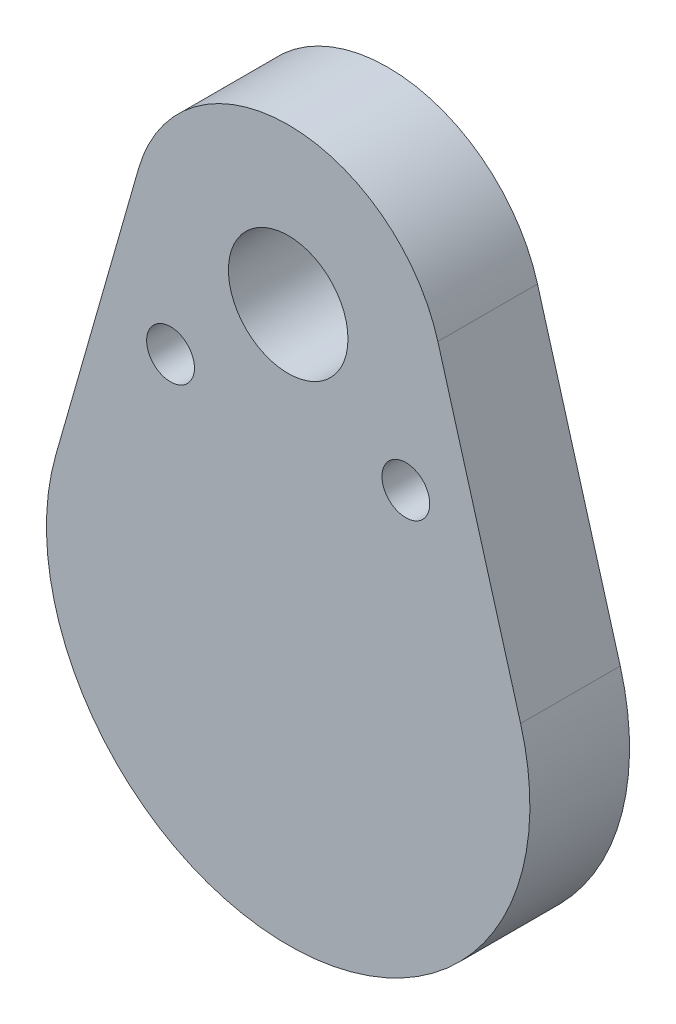
ISO-10303-21;
HEADER;
FILE_DESCRIPTION(('STEP AP214'),'2;1');
FILE_NAME('part.step','',(''),(''),'','','');
FILE_SCHEMA(('AUTOMOTIVE_DESIGN { 1 0 10303 214 1 1 1 1 }'));
ENDSEC;
DATA;
#1=APPLICATION_CONTEXT('core data for automotive mechanical design processes');
#2=APPLICATION_PROTOCOL_DEFINITION('international standard','automotive_design',2000,#1);
#3=PRODUCT_CONTEXT('',#1,'mechanical');
#4=PRODUCT('Part','Part','',(#3));
#5=PRODUCT_RELATED_PRODUCT_CATEGORY('part','',(#4));
#6=PRODUCT_DEFINITION_FORMATION('','',#4);
#7=PRODUCT_DEFINITION_CONTEXT('part definition',#1,'design');
#8=PRODUCT_DEFINITION('design','',#6,#7);
#9=PRODUCT_DEFINITION_SHAPE('','',#8);
#10=(LENGTH_UNIT() NAMED_UNIT(*) SI_UNIT(.MILLI.,.METRE.));
#11=(NAMED_UNIT(*) PLANE_ANGLE_UNIT() SI_UNIT($,.RADIAN.));
#12=(NAMED_UNIT(*) SI_UNIT($,.STERADIAN.) SOLID_ANGLE_UNIT());
#13=UNCERTAINTY_MEASURE_WITH_UNIT(LENGTH_MEASURE(1.E-05),#10,'distance_accuracy_value','');
#14=(GEOMETRIC_REPRESENTATION_CONTEXT(3) GLOBAL_UNCERTAINTY_ASSIGNED_CONTEXT((#13)) GLOBAL_UNIT_ASSIGNED_CONTEXT((#10,
#11,#12)) REPRESENTATION_CONTEXT('',''));
#15=CARTESIAN_POINT('',(0.,0.,0.));
#16=DIRECTION('',(0.,0.,1.));
#17=DIRECTION('',(1.,0.,0.));
#18=AXIS2_PLACEMENT_3D('',#15,#16,#17);
#19=CARTESIAN_POINT('',(0.,15.7136903035324,5.));
#20=DIRECTION('',(0.,0.,-1.));
#21=DIRECTION('',(-1.,0.,0.));
#22=AXIS2_PLACEMENT_3D('',#19,#20,#21);
#23=PLANE('',#22);
#24=CARTESIAN_POINT('',(0.,15.7136903035324,5.));
#25=DIRECTION('',(0.,0.,1.));
#26=DIRECTION('',(-1.,0.,0.));
#27=AXIS2_PLACEMENT_3D('',#24,#25,#26);
#28=CIRCLE('',#27,7.81260254444824);
#29=CARTESIAN_POINT('',(7.51165464801782,17.8612011804389,5.));
#30=VERTEX_POINT('',#29);
#31=CARTESIAN_POINT('',(-7.51165464801782,17.8612011804388,5.));
#32=VERTEX_POINT('',#31);
#33=EDGE_CURVE('E93',#30,#32,#28,.T.);
#34=ORIENTED_EDGE('',*,*,#33,.T.);
#35=DIRECTION('',(-0.274877784283608,-0.961479174869292,0.));
#36=VECTOR('',#35,1.);
#37=CARTESIAN_POINT('',(-7.51165464801782,17.8612011804388,5.));
#38=LINE('',#37,#36);
#39=CARTESIAN_POINT('',(-11.6646143122787,3.33480268786675,5.));
#40=VERTEX_POINT('',#39);
#41=EDGE_CURVE('E88',#32,#40,#38,.T.);
#42=ORIENTED_EDGE('',*,*,#41,.T.);
#43=CARTESIAN_POINT('',(0.,0.,5.));
#44=DIRECTION('',(0.,0.,1.));
#45=DIRECTION('',(-1.,0.,0.));
#46=AXIS2_PLACEMENT_3D('',#43,#44,#45);
#47=CIRCLE('',#46,12.1319469180021);
#48=CARTESIAN_POINT('',(11.6646143122787,3.33480268786675,5.));
#49=VERTEX_POINT('',#48);
#50=EDGE_CURVE('E91',#40,#49,#47,.T.);
#51=ORIENTED_EDGE('',*,*,#50,.T.);
#52=DIRECTION('',(-0.274877784283608,0.961479174869292,0.));
#53=VECTOR('',#52,1.);
#54=CARTESIAN_POINT('',(7.51165464801782,17.8612011804389,5.));
#55=LINE('',#54,#53);
#56=EDGE_CURVE('E58',#49,#30,#55,.T.);
#57=ORIENTED_EDGE('',*,*,#56,.T.);
#58=EDGE_LOOP('',(#34,#42,#51,#57));
#59=FACE_BOUND('',#58,.T.);
#60=CARTESIAN_POINT('',(0.,15.7136903035324,5.));
#61=DIRECTION('',(0.,0.,1.));
#62=DIRECTION('',(1.,0.,0.));
#63=AXIS2_PLACEMENT_3D('',#60,#61,#62);
#64=CIRCLE('',#63,3.);
#65=CARTESIAN_POINT('',(3.,15.7136903035324,5.));
#66=VERTEX_POINT('',#65);
#67=EDGE_CURVE('E119',#66,#66,#64,.T.);
#68=ORIENTED_EDGE('',*,*,#67,.F.);
#69=EDGE_LOOP('',(#68));
#70=FACE_BOUND('',#69,.T.);
#71=CARTESIAN_POINT('',(5.90478543428235,10.5980019341528,5.));
#72=DIRECTION('',(0.,0.,1.));
#73=DIRECTION('',(1.,0.,0.));
#74=AXIS2_PLACEMENT_3D('',#71,#72,#73);
#75=CIRCLE('',#74,1.2);
#76=CARTESIAN_POINT('',(7.10478543428235,10.5980019341528,5.));
#77=VERTEX_POINT('',#76);
#78=EDGE_CURVE('E130',#77,#77,#75,.T.);
#79=ORIENTED_EDGE('',*,*,#78,.F.);
#80=EDGE_LOOP('',(#79));
#81=FACE_BOUND('',#80,.T.);
#82=CARTESIAN_POINT('',(-5.90478543428235,10.5980019341528,5.));
#83=DIRECTION('',(0.,0.,1.));
#84=DIRECTION('',(1.,0.,0.));
#85=AXIS2_PLACEMENT_3D('',#82,#83,#84);
#86=CIRCLE('',#85,1.2);
#87=CARTESIAN_POINT('',(-4.70478543428235,10.5980019341528,5.));
#88=VERTEX_POINT('',#87);
#89=EDGE_CURVE('E156',#88,#88,#86,.T.);
#90=ORIENTED_EDGE('',*,*,#89,.F.);
#91=EDGE_LOOP('',(#90));
#92=FACE_BOUND('',#91,.T.);
#93=ADVANCED_FACE('F40',(#59,#70,#81,#92),#23,.F.);
#94=CARTESIAN_POINT('',(0.,15.7136903035324,0.));
#95=DIRECTION('',(0.,0.,-1.));
#96=DIRECTION('',(-1.,0.,0.));
#97=AXIS2_PLACEMENT_3D('',#94,#95,#96);
#98=PLANE('',#97);
#99=CARTESIAN_POINT('',(5.90478543428235,10.5980019341528,0.));
#100=DIRECTION('',(0.,0.,1.));
#101=DIRECTION('',(1.,0.,0.));
#102=AXIS2_PLACEMENT_3D('',#99,#100,#101);
#103=CIRCLE('',#102,1.2);
#104=CARTESIAN_POINT('',(7.10478543428235,10.5980019341528,0.));
#105=VERTEX_POINT('',#104);
#106=EDGE_CURVE('E127',#105,#105,#103,.T.);
#107=ORIENTED_EDGE('',*,*,#106,.T.);
#108=EDGE_LOOP('',(#107));
#109=FACE_BOUND('',#108,.T.);
#110=CARTESIAN_POINT('',(0.,15.7136903035324,0.));
#111=DIRECTION('',(0.,0.,1.));
#112=DIRECTION('',(-1.,0.,0.));
#113=AXIS2_PLACEMENT_3D('',#110,#111,#112);
#114=CIRCLE('',#113,7.81260254444824);
#115=CARTESIAN_POINT('',(7.51165464801782,17.8612011804389,0.));
#116=VERTEX_POINT('',#115);
#117=CARTESIAN_POINT('',(-7.51165464801782,17.8612011804388,0.));
#118=VERTEX_POINT('',#117);
#119=EDGE_CURVE('E125',#116,#118,#114,.T.);
#120=ORIENTED_EDGE('',*,*,#119,.F.);
#121=DIRECTION('',(-0.274877784283608,0.961479174869292,0.));
#122=VECTOR('',#121,1.);
#123=CARTESIAN_POINT('',(7.51165464801782,17.8612011804389,0.));
#124=LINE('',#123,#122);
#125=CARTESIAN_POINT('',(11.6646143122787,3.33480268786675,0.));
#126=VERTEX_POINT('',#125);
#127=EDGE_CURVE('E81',#126,#116,#124,.T.);
#128=ORIENTED_EDGE('',*,*,#127,.F.);
#129=CARTESIAN_POINT('',(0.,0.,0.));
#130=DIRECTION('',(0.,0.,1.));
#131=DIRECTION('',(-1.,0.,0.));
#132=AXIS2_PLACEMENT_3D('',#129,#130,#131);
#133=CIRCLE('',#132,12.1319469180021);
#134=CARTESIAN_POINT('',(-11.6646143122787,3.33480268786675,0.));
#135=VERTEX_POINT('',#134);
#136=EDGE_CURVE('E75',#135,#126,#133,.T.);
#137=ORIENTED_EDGE('',*,*,#136,.F.);
#138=DIRECTION('',(-0.274877784283608,-0.961479174869292,0.));
#139=VECTOR('',#138,1.);
#140=CARTESIAN_POINT('',(-7.51165464801782,17.8612011804388,0.));
#141=LINE('',#140,#139);
#142=EDGE_CURVE('E98',#118,#135,#141,.T.);
#143=ORIENTED_EDGE('',*,*,#142,.F.);
#144=EDGE_LOOP('',(#120,#128,#137,#143));
#145=FACE_BOUND('',#144,.T.);
#146=CARTESIAN_POINT('',(0.,15.7136903035324,0.));
#147=DIRECTION('',(0.,0.,1.));
#148=DIRECTION('',(1.,0.,0.));
#149=AXIS2_PLACEMENT_3D('',#146,#147,#148);
#150=CIRCLE('',#149,3.);
#151=CARTESIAN_POINT('',(3.,15.7136903035324,0.));
#152=VERTEX_POINT('',#151);
#153=EDGE_CURVE('E126',#152,#152,#150,.T.);
#154=ORIENTED_EDGE('',*,*,#153,.T.);
#155=EDGE_LOOP('',(#154));
#156=FACE_BOUND('',#155,.T.);
#157=CARTESIAN_POINT('',(-5.90478543428235,10.5980019341528,0.));
#158=DIRECTION('',(0.,0.,1.));
#159=DIRECTION('',(1.,0.,0.));
#160=AXIS2_PLACEMENT_3D('',#157,#158,#159);
#161=CIRCLE('',#160,1.2);
#162=CARTESIAN_POINT('',(-4.70478543428235,10.5980019341528,0.));
#163=VERTEX_POINT('',#162);
#164=EDGE_CURVE('E159',#163,#163,#161,.T.);
#165=ORIENTED_EDGE('',*,*,#164,.T.);
#166=EDGE_LOOP('',(#165));
#167=FACE_BOUND('',#166,.T.);
#168=ADVANCED_FACE('F145',(#109,#145,#156,#167),#98,.T.);
#169=CARTESIAN_POINT('',(0.,15.7136903035324,5.));
#170=DIRECTION('',(0.,0.,-1.));
#171=DIRECTION('',(-1.,0.,0.));
#172=AXIS2_PLACEMENT_3D('',#169,#170,#171);
#173=CYLINDRICAL_SURFACE('',#172,7.81260254444824);
#174=ORIENTED_EDGE('',*,*,#119,.T.);
#175=DIRECTION('',(0.,0.,-1.));
#176=VECTOR('',#175,1.);
#177=CARTESIAN_POINT('',(-7.51165464801782,17.8612011804388,5.));
#178=LINE('',#177,#176);
#179=EDGE_CURVE('E12',#32,#118,#178,.T.);
#180=ORIENTED_EDGE('',*,*,#179,.F.);
#181=ORIENTED_EDGE('',*,*,#33,.F.);
#182=DIRECTION('',(0.,0.,-1.));
#183=VECTOR('',#182,1.);
#184=CARTESIAN_POINT('',(7.51165464801782,17.8612011804389,5.));
#185=LINE('',#184,#183);
#186=EDGE_CURVE('E105',#30,#116,#185,.T.);
#187=ORIENTED_EDGE('',*,*,#186,.T.);
#188=EDGE_LOOP('',(#174,#180,#181,#187));
#189=FACE_BOUND('',#188,.T.);
#190=ADVANCED_FACE('F42',(#189),#173,.T.);
#191=CARTESIAN_POINT('',(-7.51165464801782,17.8612011804388,5.));
#192=DIRECTION('',(0.961479174869292,-0.274877784283608,0.));
#193=DIRECTION('',(0.274877784283608,0.961479174869292,0.));
#194=AXIS2_PLACEMENT_3D('',#191,#192,#193);
#195=PLANE('',#194);
#196=ORIENTED_EDGE('',*,*,#142,.T.);
#197=DIRECTION('',(0.,0.,-1.));
#198=VECTOR('',#197,1.);
#199=CARTESIAN_POINT('',(-11.6646143122787,3.33480268786675,5.));
#200=LINE('',#199,#198);
#201=EDGE_CURVE('E50',#40,#135,#200,.T.);
#202=ORIENTED_EDGE('',*,*,#201,.F.);
#203=ORIENTED_EDGE('',*,*,#41,.F.);
#204=ORIENTED_EDGE('',*,*,#179,.T.);
#205=EDGE_LOOP('',(#196,#202,#203,#204));
#206=FACE_BOUND('',#205,.T.);
#207=ADVANCED_FACE('F97',(#206),#195,.F.);
#208=CARTESIAN_POINT('',(0.,0.,5.));
#209=DIRECTION('',(0.,0.,-1.));
#210=DIRECTION('',(-1.,0.,0.));
#211=AXIS2_PLACEMENT_3D('',#208,#209,#210);
#212=CYLINDRICAL_SURFACE('',#211,12.1319469180021);
#213=ORIENTED_EDGE('',*,*,#136,.T.);
#214=DIRECTION('',(0.,0.,-1.));
#215=VECTOR('',#214,1.);
#216=CARTESIAN_POINT('',(11.6646143122787,3.33480268786675,5.));
#217=LINE('',#216,#215);
#218=EDGE_CURVE('E100',#49,#126,#217,.T.);
#219=ORIENTED_EDGE('',*,*,#218,.F.);
#220=ORIENTED_EDGE('',*,*,#50,.F.);
#221=ORIENTED_EDGE('',*,*,#201,.T.);
#222=EDGE_LOOP('',(#213,#219,#220,#221));
#223=FACE_BOUND('',#222,.T.);
#224=ADVANCED_FACE('F101',(#223),#212,.T.);
#225=CARTESIAN_POINT('',(7.51165464801782,17.8612011804389,5.));
#226=DIRECTION('',(-0.961479174869292,-0.274877784283608,0.));
#227=DIRECTION('',(0.274877784283608,-0.961479174869292,0.));
#228=AXIS2_PLACEMENT_3D('',#225,#226,#227);
#229=PLANE('',#228);
#230=ORIENTED_EDGE('',*,*,#127,.T.);
#231=ORIENTED_EDGE('',*,*,#186,.F.);
#232=ORIENTED_EDGE('',*,*,#56,.F.);
#233=ORIENTED_EDGE('',*,*,#218,.T.);
#234=EDGE_LOOP('',(#230,#231,#232,#233));
#235=FACE_BOUND('',#234,.T.);
#236=ADVANCED_FACE('F142',(#235),#229,.F.);
#237=CARTESIAN_POINT('',(0.,15.7136903035324,5.));
#238=DIRECTION('',(0.,0.,-1.));
#239=DIRECTION('',(-1.,0.,0.));
#240=AXIS2_PLACEMENT_3D('',#237,#238,#239);
#241=CYLINDRICAL_SURFACE('',#240,3.);
#242=ORIENTED_EDGE('',*,*,#67,.T.);
#243=EDGE_LOOP('',(#242));
#244=FACE_BOUND('',#243,.T.);
#245=ORIENTED_EDGE('',*,*,#153,.F.);
#246=EDGE_LOOP('',(#245));
#247=FACE_BOUND('',#246,.T.);
#248=ADVANCED_FACE('F175',(#244,#247),#241,.F.);
#249=CARTESIAN_POINT('',(5.90478543428235,10.5980019341528,5.));
#250=DIRECTION('',(0.,0.,-1.));
#251=DIRECTION('',(-1.,0.,0.));
#252=AXIS2_PLACEMENT_3D('',#249,#250,#251);
#253=CYLINDRICAL_SURFACE('',#252,1.2);
#254=ORIENTED_EDGE('',*,*,#78,.T.);
#255=EDGE_LOOP('',(#254));
#256=FACE_BOUND('',#255,.T.);
#257=ORIENTED_EDGE('',*,*,#106,.F.);
#258=EDGE_LOOP('',(#257));
#259=FACE_BOUND('',#258,.T.);
#260=ADVANCED_FACE('F169',(#256,#259),#253,.F.);
#261=CARTESIAN_POINT('',(-5.90478543428235,10.5980019341528,5.));
#262=DIRECTION('',(0.,0.,-1.));
#263=DIRECTION('',(-1.,0.,0.));
#264=AXIS2_PLACEMENT_3D('',#261,#262,#263);
#265=CYLINDRICAL_SURFACE('',#264,1.2);
#266=ORIENTED_EDGE('',*,*,#89,.T.);
#267=EDGE_LOOP('',(#266));
#268=FACE_BOUND('',#267,.T.);
#269=ORIENTED_EDGE('',*,*,#164,.F.);
#270=EDGE_LOOP('',(#269));
#271=FACE_BOUND('',#270,.T.);
#272=ADVANCED_FACE('F167',(#268,#271),#265,.F.);
#273=CLOSED_SHELL('',(#93,#168,#190,#207,#224,#236,#248,#260,#272));
#274=MANIFOLD_SOLID_BREP('B2',#273);
#275=ADVANCED_BREP_SHAPE_REPRESENTATION('',(#18,#274),#14);
#276=SHAPE_DEFINITION_REPRESENTATION(#9,#275);
ENDSEC;
END-ISO-10303-21;
